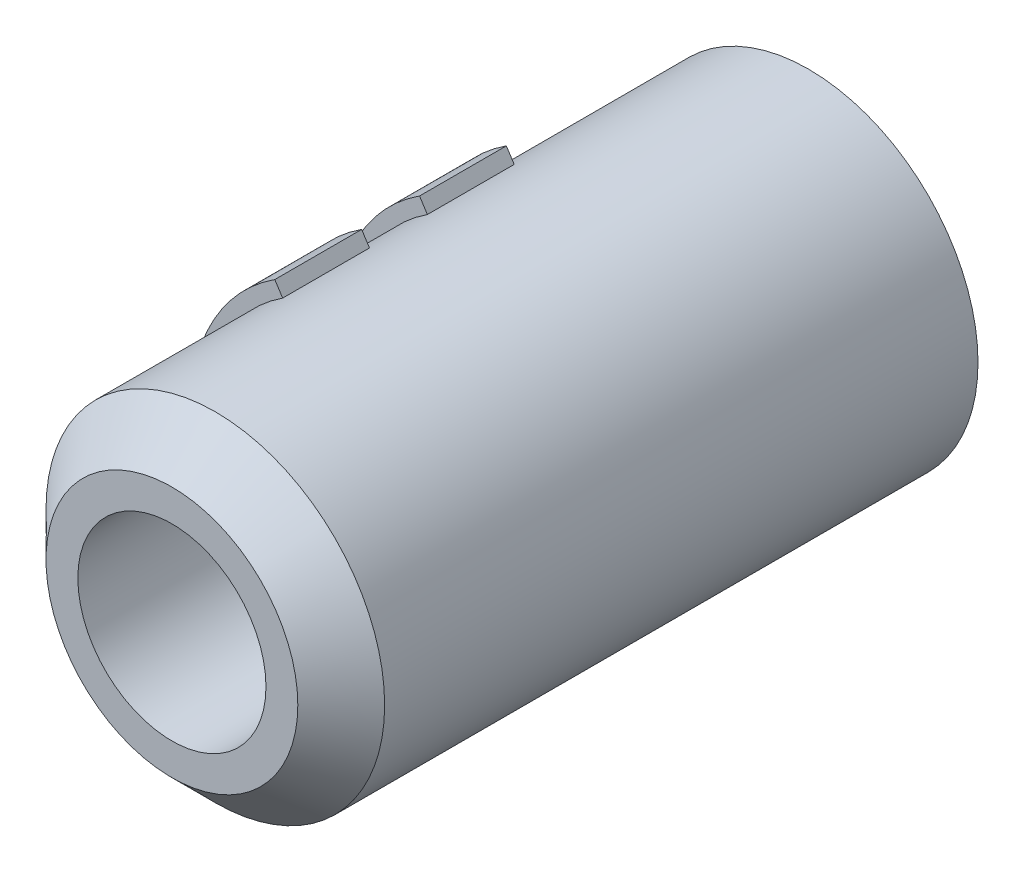
ISO-10303-21;
HEADER;
FILE_DESCRIPTION(('STEP AP214'),'2;1');
FILE_NAME('part.step','',(''),(''),'','','');
FILE_SCHEMA(('AUTOMOTIVE_DESIGN { 1 0 10303 214 1 1 1 1 }'));
ENDSEC;
DATA;
#1=APPLICATION_CONTEXT('core data for automotive mechanical design processes');
#2=APPLICATION_PROTOCOL_DEFINITION('international standard','automotive_design',2000,#1);
#3=PRODUCT_CONTEXT('',#1,'mechanical');
#4=PRODUCT('Part','Part','',(#3));
#5=PRODUCT_RELATED_PRODUCT_CATEGORY('part','',(#4));
#6=PRODUCT_DEFINITION_FORMATION('','',#4);
#7=PRODUCT_DEFINITION_CONTEXT('part definition',#1,'design');
#8=PRODUCT_DEFINITION('design','',#6,#7);
#9=PRODUCT_DEFINITION_SHAPE('','',#8);
#10=(LENGTH_UNIT() NAMED_UNIT(*) SI_UNIT(.MILLI.,.METRE.));
#11=(NAMED_UNIT(*) PLANE_ANGLE_UNIT() SI_UNIT($,.RADIAN.));
#12=(NAMED_UNIT(*) SI_UNIT($,.STERADIAN.) SOLID_ANGLE_UNIT());
#13=UNCERTAINTY_MEASURE_WITH_UNIT(LENGTH_MEASURE(1.E-05),#10,'distance_accuracy_value','');
#14=(GEOMETRIC_REPRESENTATION_CONTEXT(3) GLOBAL_UNCERTAINTY_ASSIGNED_CONTEXT((#13)) GLOBAL_UNIT_ASSIGNED_CONTEXT((#10,
#11,#12)) REPRESENTATION_CONTEXT('',''));
#15=CARTESIAN_POINT('',(0.,0.,0.));
#16=DIRECTION('',(0.,0.,1.));
#17=DIRECTION('',(1.,0.,0.));
#18=AXIS2_PLACEMENT_3D('',#15,#16,#17);
#19=CARTESIAN_POINT('',(0.,0.,22.));
#20=DIRECTION('',(0.,0.,1.));
#21=DIRECTION('',(1.,0.,0.));
#22=AXIS2_PLACEMENT_3D('',#19,#20,#21);
#23=PLANE('',#22);
#24=CARTESIAN_POINT('',(0.,0.,22.));
#25=DIRECTION('',(0.,0.,1.));
#26=DIRECTION('',(1.,0.,0.));
#27=AXIS2_PLACEMENT_3D('',#24,#25,#26);
#28=CIRCLE('',#27,4.35000000000001);
#29=CARTESIAN_POINT('',(4.35000000000001,0.,22.));
#30=VERTEX_POINT('',#29);
#31=EDGE_CURVE('E58',#30,#30,#28,.T.);
#32=ORIENTED_EDGE('',*,*,#31,.T.);
#33=EDGE_LOOP('',(#32));
#34=FACE_BOUND('',#33,.T.);
#35=CARTESIAN_POINT('',(0.,0.,22.));
#36=DIRECTION('',(0.,0.,1.));
#37=DIRECTION('',(1.,0.,0.));
#38=AXIS2_PLACEMENT_3D('',#35,#36,#37);
#39=CIRCLE('',#38,3.25);
#40=CARTESIAN_POINT('',(3.25,0.,22.));
#41=VERTEX_POINT('',#40);
#42=EDGE_CURVE('E180',#41,#41,#39,.T.);
#43=ORIENTED_EDGE('',*,*,#42,.F.);
#44=EDGE_LOOP('',(#43));
#45=FACE_BOUND('',#44,.T.);
#46=ADVANCED_FACE('F49',(#34,#45),#23,.T.);
#47=CARTESIAN_POINT('',(0.,0.,0.));
#48=DIRECTION('',(0.,0.,1.));
#49=DIRECTION('',(1.,0.,0.));
#50=AXIS2_PLACEMENT_3D('',#47,#48,#49);
#51=PLANE('',#50);
#52=CARTESIAN_POINT('',(0.,0.,0.));
#53=DIRECTION('',(0.,0.,1.));
#54=DIRECTION('',(1.,0.,0.));
#55=AXIS2_PLACEMENT_3D('',#52,#53,#54);
#56=CIRCLE('',#55,5.85);
#57=CARTESIAN_POINT('',(5.85,0.,0.));
#58=VERTEX_POINT('',#57);
#59=EDGE_CURVE('E183',#58,#58,#56,.T.);
#60=ORIENTED_EDGE('',*,*,#59,.F.);
#61=EDGE_LOOP('',(#60));
#62=FACE_BOUND('',#61,.T.);
#63=CARTESIAN_POINT('',(0.,0.,0.));
#64=DIRECTION('',(0.,0.,1.));
#65=DIRECTION('',(1.,0.,0.));
#66=AXIS2_PLACEMENT_3D('',#63,#64,#65);
#67=CIRCLE('',#66,3.25);
#68=CARTESIAN_POINT('',(3.25,0.,0.));
#69=VERTEX_POINT('',#68);
#70=EDGE_CURVE('E179',#69,#69,#67,.T.);
#71=ORIENTED_EDGE('',*,*,#70,.T.);
#72=EDGE_LOOP('',(#71));
#73=FACE_BOUND('',#72,.T.);
#74=ADVANCED_FACE('F208',(#62,#73),#51,.F.);
#75=CARTESIAN_POINT('',(0.,0.,22.));
#76=DIRECTION('',(0.,0.,-1.));
#77=DIRECTION('',(-1.,0.,0.));
#78=AXIS2_PLACEMENT_3D('',#75,#76,#77);
#79=CYLINDRICAL_SURFACE('',#78,5.85);
#80=DIRECTION('',(0.,0.,1.));
#81=VECTOR('',#80,1.);
#82=CARTESIAN_POINT('',(-1.2306209203372,-5.71909714469237,7.));
#83=LINE('',#82,#81);
#84=CARTESIAN_POINT('',(-1.2306209203372,-5.71909714469237,7.));
#85=VERTEX_POINT('',#84);
#86=CARTESIAN_POINT('',(-1.2306209203372,-5.71909714469237,10.));
#87=VERTEX_POINT('',#86);
#88=EDGE_CURVE('E65',#85,#87,#83,.T.);
#89=ORIENTED_EDGE('',*,*,#88,.F.);
#90=CARTESIAN_POINT('',(0.,0.,7.));
#91=DIRECTION('',(0.,0.,1.));
#92=DIRECTION('',(-1.,0.,0.));
#93=AXIS2_PLACEMENT_3D('',#90,#91,#92);
#94=CIRCLE('',#93,5.85);
#95=CARTESIAN_POINT('',(-3.1738319754361,4.91419277111708,7.));
#96=VERTEX_POINT('',#95);
#97=EDGE_CURVE('E70',#96,#85,#94,.T.);
#98=ORIENTED_EDGE('',*,*,#97,.F.);
#99=DIRECTION('',(0.,0.,1.));
#100=VECTOR('',#99,1.);
#101=CARTESIAN_POINT('',(-3.1738319754361,4.91419277111708,7.));
#102=LINE('',#101,#100);
#103=CARTESIAN_POINT('',(-3.1738319754361,4.91419277111708,10.));
#104=VERTEX_POINT('',#103);
#105=EDGE_CURVE('E134',#96,#104,#102,.T.);
#106=ORIENTED_EDGE('',*,*,#105,.T.);
#107=CARTESIAN_POINT('',(0.,0.,10.));
#108=DIRECTION('',(0.,0.,1.));
#109=DIRECTION('',(-1.,0.,0.));
#110=AXIS2_PLACEMENT_3D('',#107,#108,#109);
#111=CIRCLE('',#110,5.85);
#112=EDGE_CURVE('E138',#104,#87,#111,.T.);
#113=ORIENTED_EDGE('',*,*,#112,.T.);
#114=EDGE_LOOP('',(#89,#98,#106,#113));
#115=FACE_BOUND('',#114,.T.);
#116=DIRECTION('',(0.,0.,-1.));
#117=VECTOR('',#116,1.);
#118=CARTESIAN_POINT('',(-3.1738319754361,4.91419277111708,15.));
#119=LINE('',#118,#117);
#120=CARTESIAN_POINT('',(-3.1738319754361,4.91419277111708,15.));
#121=VERTEX_POINT('',#120);
#122=CARTESIAN_POINT('',(-3.1738319754361,4.91419277111708,12.));
#123=VERTEX_POINT('',#122);
#124=EDGE_CURVE('E176',#121,#123,#119,.T.);
#125=ORIENTED_EDGE('',*,*,#124,.F.);
#126=CARTESIAN_POINT('',(0.,0.,15.));
#127=DIRECTION('',(0.,0.,-1.));
#128=DIRECTION('',(1.,0.,0.));
#129=AXIS2_PLACEMENT_3D('',#126,#127,#128);
#130=CIRCLE('',#129,5.85);
#131=CARTESIAN_POINT('',(-1.23062092033721,-5.71909714469237,15.));
#132=VERTEX_POINT('',#131);
#133=EDGE_CURVE('E150',#132,#121,#130,.T.);
#134=ORIENTED_EDGE('',*,*,#133,.F.);
#135=DIRECTION('',(0.,0.,-1.));
#136=VECTOR('',#135,1.);
#137=CARTESIAN_POINT('',(-1.23062092033721,-5.71909714469237,15.));
#138=LINE('',#137,#136);
#139=CARTESIAN_POINT('',(-1.23062092033721,-5.71909714469237,12.));
#140=VERTEX_POINT('',#139);
#141=EDGE_CURVE('E161',#132,#140,#138,.T.);
#142=ORIENTED_EDGE('',*,*,#141,.T.);
#143=CARTESIAN_POINT('',(0.,0.,12.));
#144=DIRECTION('',(0.,0.,-1.));
#145=DIRECTION('',(1.,0.,0.));
#146=AXIS2_PLACEMENT_3D('',#143,#144,#145);
#147=CIRCLE('',#146,5.85);
#148=EDGE_CURVE('E149',#140,#123,#147,.T.);
#149=ORIENTED_EDGE('',*,*,#148,.T.);
#150=EDGE_LOOP('',(#125,#134,#142,#149));
#151=FACE_BOUND('',#150,.T.);
#152=CARTESIAN_POINT('',(0.,0.,20.5));
#153=DIRECTION('',(0.,0.,1.));
#154=DIRECTION('',(1.,0.,0.));
#155=AXIS2_PLACEMENT_3D('',#152,#153,#154);
#156=CIRCLE('',#155,5.85);
#157=CARTESIAN_POINT('',(5.85,0.,20.5));
#158=VERTEX_POINT('',#157);
#159=EDGE_CURVE('E13',#158,#158,#156,.F.);
#160=ORIENTED_EDGE('',*,*,#159,.T.);
#161=EDGE_LOOP('',(#160));
#162=FACE_BOUND('',#161,.T.);
#163=ORIENTED_EDGE('',*,*,#59,.T.);
#164=EDGE_LOOP('',(#163));
#165=FACE_BOUND('',#164,.T.);
#166=ADVANCED_FACE('F203',(#115,#151,#162,#165),#79,.T.);
#167=CARTESIAN_POINT('',(0.,0.,22.));
#168=DIRECTION('',(0.,0.,-1.));
#169=DIRECTION('',(-1.,0.,0.));
#170=AXIS2_PLACEMENT_3D('',#167,#168,#169);
#171=CYLINDRICAL_SURFACE('',#170,3.25);
#172=ORIENTED_EDGE('',*,*,#42,.T.);
#173=EDGE_LOOP('',(#172));
#174=FACE_BOUND('',#173,.T.);
#175=ORIENTED_EDGE('',*,*,#70,.F.);
#176=EDGE_LOOP('',(#175));
#177=FACE_BOUND('',#176,.T.);
#178=ADVANCED_FACE('F194',(#174,#177),#171,.F.);
#179=CARTESIAN_POINT('',(0.,0.,22.));
#180=DIRECTION('',(0.,0.,-1.));
#181=DIRECTION('',(-1.,0.,0.));
#182=AXIS2_PLACEMENT_3D('',#179,#180,#181);
#183=CONICAL_SURFACE('',#182,4.35000000000001,0.785398163397446);
#184=ORIENTED_EDGE('',*,*,#159,.F.);
#185=EDGE_LOOP('',(#184));
#186=FACE_BOUND('',#185,.T.);
#187=ORIENTED_EDGE('',*,*,#31,.F.);
#188=EDGE_LOOP('',(#187));
#189=FACE_BOUND('',#188,.T.);
#190=ADVANCED_FACE('F52',(#186,#189),#183,.T.);
#191=CARTESIAN_POINT('',(-3.1738319754361,4.91419277111708,15.));
#192=DIRECTION('',(-0.840032952327706,-0.542535380416427,0.));
#193=DIRECTION('',(0.542535380416427,-0.840032952327707,0.));
#194=AXIS2_PLACEMENT_3D('',#191,#192,#193);
#195=PLANE('',#194);
#196=DIRECTION('',(-0.542535380416427,0.840032952327706,0.));
#197=VECTOR('',#196,1.);
#198=CARTESIAN_POINT('',(-3.1738319754361,4.91419277111708,12.));
#199=LINE('',#198,#197);
#200=CARTESIAN_POINT('',(-3.44509966564431,5.33420924728093,12.));
#201=VERTEX_POINT('',#200);
#202=EDGE_CURVE('E163',#123,#201,#199,.T.);
#203=ORIENTED_EDGE('',*,*,#202,.T.);
#204=DIRECTION('',(0.,0.,-1.));
#205=VECTOR('',#204,1.);
#206=CARTESIAN_POINT('',(-3.44509966564431,5.33420924728093,15.));
#207=LINE('',#206,#205);
#208=CARTESIAN_POINT('',(-3.44509966564431,5.33420924728093,15.));
#209=VERTEX_POINT('',#208);
#210=EDGE_CURVE('E173',#209,#201,#207,.T.);
#211=ORIENTED_EDGE('',*,*,#210,.F.);
#212=DIRECTION('',(-0.542535380416427,0.840032952327706,0.));
#213=VECTOR('',#212,1.);
#214=CARTESIAN_POINT('',(-3.1738319754361,4.91419277111708,15.));
#215=LINE('',#214,#213);
#216=EDGE_CURVE('E153',#121,#209,#215,.T.);
#217=ORIENTED_EDGE('',*,*,#216,.F.);
#218=ORIENTED_EDGE('',*,*,#124,.T.);
#219=EDGE_LOOP('',(#203,#211,#217,#218));
#220=FACE_BOUND('',#219,.T.);
#221=ADVANCED_FACE('F193',(#220),#195,.F.);
#222=CARTESIAN_POINT('',(0.,0.,15.));
#223=DIRECTION('',(0.,0.,-1.));
#224=DIRECTION('',(-1.,0.,0.));
#225=AXIS2_PLACEMENT_3D('',#222,#223,#224);
#226=CYLINDRICAL_SURFACE('',#225,6.35);
#227=CARTESIAN_POINT('',(0.,0.,12.));
#228=DIRECTION('',(0.,0.,1.));
#229=DIRECTION('',(1.,0.,0.));
#230=AXIS2_PLACEMENT_3D('',#227,#228,#229);
#231=CIRCLE('',#230,6.35);
#232=CARTESIAN_POINT('',(-1.3358021955797,-6.20790886646095,12.));
#233=VERTEX_POINT('',#232);
#234=EDGE_CURVE('E165',#201,#233,#231,.T.);
#235=ORIENTED_EDGE('',*,*,#234,.T.);
#236=DIRECTION('',(0.,0.,-1.));
#237=VECTOR('',#236,1.);
#238=CARTESIAN_POINT('',(-1.3358021955797,-6.20790886646095,15.));
#239=LINE('',#238,#237);
#240=CARTESIAN_POINT('',(-1.3358021955797,-6.20790886646095,15.));
#241=VERTEX_POINT('',#240);
#242=EDGE_CURVE('E170',#241,#233,#239,.T.);
#243=ORIENTED_EDGE('',*,*,#242,.F.);
#244=CARTESIAN_POINT('',(0.,0.,15.));
#245=DIRECTION('',(0.,0.,1.));
#246=DIRECTION('',(1.,0.,0.));
#247=AXIS2_PLACEMENT_3D('',#244,#245,#246);
#248=CIRCLE('',#247,6.35);
#249=EDGE_CURVE('E156',#209,#241,#248,.T.);
#250=ORIENTED_EDGE('',*,*,#249,.F.);
#251=ORIENTED_EDGE('',*,*,#210,.T.);
#252=EDGE_LOOP('',(#235,#243,#250,#251));
#253=FACE_BOUND('',#252,.T.);
#254=ADVANCED_FACE('F200',(#253),#226,.T.);
#255=CARTESIAN_POINT('',(-1.23062092033721,-5.71909714469237,15.));
#256=DIRECTION('',(-0.977623443537157,0.210362550484992,0.));
#257=DIRECTION('',(-0.210362550484992,-0.977623443537157,0.));
#258=AXIS2_PLACEMENT_3D('',#255,#256,#257);
#259=PLANE('',#258);
#260=DIRECTION('',(0.210362550484992,0.977623443537157,0.));
#261=VECTOR('',#260,1.);
#262=CARTESIAN_POINT('',(-1.23062092033721,-5.71909714469237,12.));
#263=LINE('',#262,#261);
#264=EDGE_CURVE('E154',#233,#140,#263,.T.);
#265=ORIENTED_EDGE('',*,*,#264,.T.);
#266=ORIENTED_EDGE('',*,*,#141,.F.);
#267=DIRECTION('',(0.210362550484992,0.977623443537157,0.));
#268=VECTOR('',#267,1.);
#269=CARTESIAN_POINT('',(-1.23062092033721,-5.71909714469237,15.));
#270=LINE('',#269,#268);
#271=EDGE_CURVE('E158',#241,#132,#270,.T.);
#272=ORIENTED_EDGE('',*,*,#271,.F.);
#273=ORIENTED_EDGE('',*,*,#242,.T.);
#274=EDGE_LOOP('',(#265,#266,#272,#273));
#275=FACE_BOUND('',#274,.T.);
#276=ADVANCED_FACE('F236',(#275),#259,.F.);
#277=CARTESIAN_POINT('',(0.,0.,15.));
#278=DIRECTION('',(0.,0.,1.));
#279=DIRECTION('',(1.,0.,0.));
#280=AXIS2_PLACEMENT_3D('',#277,#278,#279);
#281=PLANE('',#280);
#282=ORIENTED_EDGE('',*,*,#133,.T.);
#283=ORIENTED_EDGE('',*,*,#216,.T.);
#284=ORIENTED_EDGE('',*,*,#249,.T.);
#285=ORIENTED_EDGE('',*,*,#271,.T.);
#286=EDGE_LOOP('',(#282,#283,#284,#285));
#287=FACE_BOUND('',#286,.T.);
#288=ADVANCED_FACE('F231',(#287),#281,.T.);
#289=CARTESIAN_POINT('',(0.,0.,12.));
#290=DIRECTION('',(0.,0.,1.));
#291=DIRECTION('',(1.,0.,0.));
#292=AXIS2_PLACEMENT_3D('',#289,#290,#291);
#293=PLANE('',#292);
#294=ORIENTED_EDGE('',*,*,#148,.F.);
#295=ORIENTED_EDGE('',*,*,#264,.F.);
#296=ORIENTED_EDGE('',*,*,#234,.F.);
#297=ORIENTED_EDGE('',*,*,#202,.F.);
#298=EDGE_LOOP('',(#294,#295,#296,#297));
#299=FACE_BOUND('',#298,.T.);
#300=ADVANCED_FACE('F240',(#299),#293,.F.);
#301=CARTESIAN_POINT('',(-1.2306209203372,-5.71909714469237,7.));
#302=DIRECTION('',(-0.977623443537157,0.210362550484992,0.));
#303=DIRECTION('',(-0.210362550484992,-0.977623443537157,0.));
#304=AXIS2_PLACEMENT_3D('',#301,#302,#303);
#305=PLANE('',#304);
#306=DIRECTION('',(-0.210362550484992,-0.977623443537157,0.));
#307=VECTOR('',#306,1.);
#308=CARTESIAN_POINT('',(-1.2306209203372,-5.71909714469237,10.));
#309=LINE('',#308,#307);
#310=CARTESIAN_POINT('',(-1.3358021955797,-6.20790886646095,10.));
#311=VERTEX_POINT('',#310);
#312=EDGE_CURVE('E124',#87,#311,#309,.T.);
#313=ORIENTED_EDGE('',*,*,#312,.T.);
#314=DIRECTION('',(0.,0.,1.));
#315=VECTOR('',#314,1.);
#316=CARTESIAN_POINT('',(-1.3358021955797,-6.20790886646095,7.));
#317=LINE('',#316,#315);
#318=CARTESIAN_POINT('',(-1.3358021955797,-6.20790886646095,7.));
#319=VERTEX_POINT('',#318);
#320=EDGE_CURVE('E121',#319,#311,#317,.T.);
#321=ORIENTED_EDGE('',*,*,#320,.F.);
#322=DIRECTION('',(-0.210362550484992,-0.977623443537157,0.));
#323=VECTOR('',#322,1.);
#324=CARTESIAN_POINT('',(-1.2306209203372,-5.71909714469237,7.));
#325=LINE('',#324,#323);
#326=EDGE_CURVE('E112',#85,#319,#325,.T.);
#327=ORIENTED_EDGE('',*,*,#326,.F.);
#328=ORIENTED_EDGE('',*,*,#88,.T.);
#329=EDGE_LOOP('',(#313,#321,#327,#328));
#330=FACE_BOUND('',#329,.T.);
#331=ADVANCED_FACE('F122',(#330),#305,.F.);
#332=CARTESIAN_POINT('',(0.,0.,7.));
#333=DIRECTION('',(0.,0.,1.));
#334=DIRECTION('',(1.,0.,0.));
#335=AXIS2_PLACEMENT_3D('',#332,#333,#334);
#336=CYLINDRICAL_SURFACE('',#335,6.35);
#337=CARTESIAN_POINT('',(0.,0.,10.));
#338=DIRECTION('',(0.,0.,-1.));
#339=DIRECTION('',(-1.,0.,0.));
#340=AXIS2_PLACEMENT_3D('',#337,#338,#339);
#341=CIRCLE('',#340,6.35);
#342=CARTESIAN_POINT('',(-3.44509966564432,5.33420924728093,10.));
#343=VERTEX_POINT('',#342);
#344=EDGE_CURVE('E141',#311,#343,#341,.T.);
#345=ORIENTED_EDGE('',*,*,#344,.T.);
#346=DIRECTION('',(0.,0.,1.));
#347=VECTOR('',#346,1.);
#348=CARTESIAN_POINT('',(-3.44509966564432,5.33420924728093,7.));
#349=LINE('',#348,#347);
#350=CARTESIAN_POINT('',(-3.44509966564432,5.33420924728093,7.));
#351=VERTEX_POINT('',#350);
#352=EDGE_CURVE('E127',#351,#343,#349,.T.);
#353=ORIENTED_EDGE('',*,*,#352,.F.);
#354=CARTESIAN_POINT('',(0.,0.,7.));
#355=DIRECTION('',(0.,0.,-1.));
#356=DIRECTION('',(-1.,0.,0.));
#357=AXIS2_PLACEMENT_3D('',#354,#355,#356);
#358=CIRCLE('',#357,6.35);
#359=EDGE_CURVE('E116',#319,#351,#358,.T.);
#360=ORIENTED_EDGE('',*,*,#359,.F.);
#361=ORIENTED_EDGE('',*,*,#320,.T.);
#362=EDGE_LOOP('',(#345,#353,#360,#361));
#363=FACE_BOUND('',#362,.T.);
#364=ADVANCED_FACE('F129',(#363),#336,.T.);
#365=CARTESIAN_POINT('',(-3.44509966564431,5.33420924728093,7.));
#366=DIRECTION('',(-0.840032952327707,-0.542535380416426,0.));
#367=DIRECTION('',(0.542535380416426,-0.840032952327707,0.));
#368=AXIS2_PLACEMENT_3D('',#365,#366,#367);
#369=PLANE('',#368);
#370=DIRECTION('',(0.542535380416426,-0.840032952327707,0.));
#371=VECTOR('',#370,1.);
#372=CARTESIAN_POINT('',(-3.44509966564431,5.33420924728093,10.));
#373=LINE('',#372,#371);
#374=EDGE_CURVE('E143',#343,#104,#373,.T.);
#375=ORIENTED_EDGE('',*,*,#374,.T.);
#376=ORIENTED_EDGE('',*,*,#105,.F.);
#377=DIRECTION('',(0.542535380416426,-0.840032952327707,0.));
#378=VECTOR('',#377,1.);
#379=CARTESIAN_POINT('',(-3.44509966564431,5.33420924728093,7.));
#380=LINE('',#379,#378);
#381=EDGE_CURVE('E132',#351,#96,#380,.T.);
#382=ORIENTED_EDGE('',*,*,#381,.F.);
#383=ORIENTED_EDGE('',*,*,#352,.T.);
#384=EDGE_LOOP('',(#375,#376,#382,#383));
#385=FACE_BOUND('',#384,.T.);
#386=ADVANCED_FACE('F257',(#385),#369,.F.);
#387=CARTESIAN_POINT('',(0.,0.,7.));
#388=DIRECTION('',(0.,0.,-1.));
#389=DIRECTION('',(-1.,0.,0.));
#390=AXIS2_PLACEMENT_3D('',#387,#388,#389);
#391=PLANE('',#390);
#392=ORIENTED_EDGE('',*,*,#97,.T.);
#393=ORIENTED_EDGE('',*,*,#326,.T.);
#394=ORIENTED_EDGE('',*,*,#359,.T.);
#395=ORIENTED_EDGE('',*,*,#381,.T.);
#396=EDGE_LOOP('',(#392,#393,#394,#395));
#397=FACE_BOUND('',#396,.T.);
#398=ADVANCED_FACE('F114',(#397),#391,.T.);
#399=CARTESIAN_POINT('',(0.,0.,10.));
#400=DIRECTION('',(0.,0.,-1.));
#401=DIRECTION('',(-1.,0.,0.));
#402=AXIS2_PLACEMENT_3D('',#399,#400,#401);
#403=PLANE('',#402);
#404=ORIENTED_EDGE('',*,*,#112,.F.);
#405=ORIENTED_EDGE('',*,*,#374,.F.);
#406=ORIENTED_EDGE('',*,*,#344,.F.);
#407=ORIENTED_EDGE('',*,*,#312,.F.);
#408=EDGE_LOOP('',(#404,#405,#406,#407));
#409=FACE_BOUND('',#408,.T.);
#410=ADVANCED_FACE('F261',(#409),#403,.F.);
#411=CLOSED_SHELL('',(#46,#74,#166,#178,#190,#221,#254,#276,#288,#300,#331,#364,#386,#398,#410));
#412=MANIFOLD_SOLID_BREP('B2',#411);
#413=ADVANCED_BREP_SHAPE_REPRESENTATION('',(#18,#412),#14);
#414=SHAPE_DEFINITION_REPRESENTATION(#9,#413);
ENDSEC;
END-ISO-10303-21;
